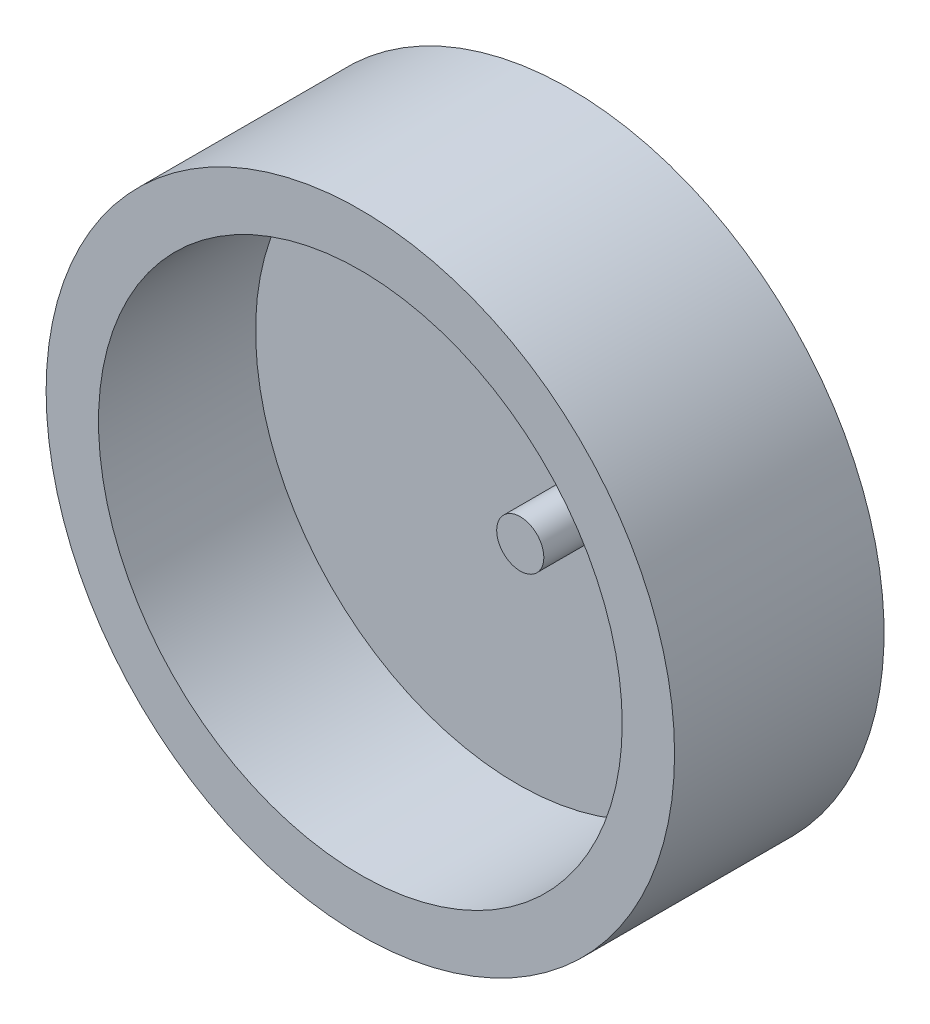
ISO-10303-21;
HEADER;
FILE_DESCRIPTION(('STEP AP214'),'2;1');
FILE_NAME('part.step','',(''),(''),'','','');
FILE_SCHEMA(('AUTOMOTIVE_DESIGN { 1 0 10303 214 1 1 1 1 }'));
ENDSEC;
DATA;
#1=APPLICATION_CONTEXT('core data for automotive mechanical design processes');
#2=APPLICATION_PROTOCOL_DEFINITION('international standard','automotive_design',2000,#1);
#3=PRODUCT_CONTEXT('',#1,'mechanical');
#4=PRODUCT('Part','Part','',(#3));
#5=PRODUCT_RELATED_PRODUCT_CATEGORY('part','',(#4));
#6=PRODUCT_DEFINITION_FORMATION('','',#4);
#7=PRODUCT_DEFINITION_CONTEXT('part definition',#1,'design');
#8=PRODUCT_DEFINITION('design','',#6,#7);
#9=PRODUCT_DEFINITION_SHAPE('','',#8);
#10=(LENGTH_UNIT() NAMED_UNIT(*) SI_UNIT(.MILLI.,.METRE.));
#11=(NAMED_UNIT(*) PLANE_ANGLE_UNIT() SI_UNIT($,.RADIAN.));
#12=(NAMED_UNIT(*) SI_UNIT($,.STERADIAN.) SOLID_ANGLE_UNIT());
#13=UNCERTAINTY_MEASURE_WITH_UNIT(LENGTH_MEASURE(1.E-05),#10,'distance_accuracy_value','');
#14=(GEOMETRIC_REPRESENTATION_CONTEXT(3) GLOBAL_UNCERTAINTY_ASSIGNED_CONTEXT((#13)) GLOBAL_UNIT_ASSIGNED_CONTEXT((#10,
#11,#12)) REPRESENTATION_CONTEXT('',''));
#15=CARTESIAN_POINT('',(0.,0.,0.));
#16=DIRECTION('',(0.,0.,1.));
#17=DIRECTION('',(1.,0.,0.));
#18=AXIS2_PLACEMENT_3D('',#15,#16,#17);
#19=CARTESIAN_POINT('',(0.,0.,30.));
#20=DIRECTION('',(0.,0.,1.));
#21=DIRECTION('',(1.,0.,0.));
#22=AXIS2_PLACEMENT_3D('',#19,#20,#21);
#23=PLANE('',#22);
#24=CARTESIAN_POINT('',(0.,0.,30.));
#25=DIRECTION('',(0.,0.,1.));
#26=DIRECTION('',(1.,0.,0.));
#27=AXIS2_PLACEMENT_3D('',#24,#25,#26);
#28=CIRCLE('',#27,60.);
#29=CARTESIAN_POINT('',(60.,0.,30.));
#30=VERTEX_POINT('',#29);
#31=EDGE_CURVE('E45',#30,#30,#28,.T.);
#32=ORIENTED_EDGE('',*,*,#31,.T.);
#33=EDGE_LOOP('',(#32));
#34=FACE_BOUND('',#33,.T.);
#35=CARTESIAN_POINT('',(0.,0.,30.));
#36=DIRECTION('',(0.,0.,1.));
#37=DIRECTION('',(1.,0.,0.));
#38=AXIS2_PLACEMENT_3D('',#35,#36,#37);
#39=CIRCLE('',#38,50.);
#40=CARTESIAN_POINT('',(50.,0.,30.));
#41=VERTEX_POINT('',#40);
#42=EDGE_CURVE('E50',#41,#41,#39,.T.);
#43=ORIENTED_EDGE('',*,*,#42,.F.);
#44=EDGE_LOOP('',(#43));
#45=FACE_BOUND('',#44,.T.);
#46=ADVANCED_FACE('F37',(#34,#45),#23,.T.);
#47=CARTESIAN_POINT('',(0.,0.,30.));
#48=DIRECTION('',(0.,0.,-1.));
#49=DIRECTION('',(-1.,0.,0.));
#50=AXIS2_PLACEMENT_3D('',#47,#48,#49);
#51=CYLINDRICAL_SURFACE('',#50,60.);
#52=ORIENTED_EDGE('',*,*,#31,.F.);
#53=EDGE_LOOP('',(#52));
#54=FACE_BOUND('',#53,.T.);
#55=CARTESIAN_POINT('',(0.,0.,-10.));
#56=DIRECTION('',(0.,0.,-1.));
#57=DIRECTION('',(-1.,0.,0.));
#58=AXIS2_PLACEMENT_3D('',#55,#56,#57);
#59=CIRCLE('',#58,60.);
#60=CARTESIAN_POINT('',(-60.,0.,-10.));
#61=VERTEX_POINT('',#60);
#62=EDGE_CURVE('E60',#61,#61,#59,.T.);
#63=ORIENTED_EDGE('',*,*,#62,.F.);
#64=EDGE_LOOP('',(#63));
#65=FACE_BOUND('',#64,.T.);
#66=ADVANCED_FACE('F39',(#54,#65),#51,.T.);
#67=CARTESIAN_POINT('',(0.,0.,30.));
#68=DIRECTION('',(0.,0.,-1.));
#69=DIRECTION('',(-1.,0.,0.));
#70=AXIS2_PLACEMENT_3D('',#67,#68,#69);
#71=CYLINDRICAL_SURFACE('',#70,50.);
#72=ORIENTED_EDGE('',*,*,#42,.T.);
#73=EDGE_LOOP('',(#72));
#74=FACE_BOUND('',#73,.T.);
#75=CARTESIAN_POINT('',(0.,0.,0.));
#76=DIRECTION('',(0.,0.,1.));
#77=DIRECTION('',(1.,0.,0.));
#78=AXIS2_PLACEMENT_3D('',#75,#76,#77);
#79=CIRCLE('',#78,50.);
#80=CARTESIAN_POINT('',(50.,0.,0.));
#81=VERTEX_POINT('',#80);
#82=EDGE_CURVE('E55',#81,#81,#79,.T.);
#83=ORIENTED_EDGE('',*,*,#82,.F.);
#84=EDGE_LOOP('',(#83));
#85=FACE_BOUND('',#84,.T.);
#86=ADVANCED_FACE('F88',(#74,#85),#71,.F.);
#87=CARTESIAN_POINT('',(0.,0.,0.));
#88=DIRECTION('',(0.,0.,-1.));
#89=DIRECTION('',(-1.,0.,0.));
#90=AXIS2_PLACEMENT_3D('',#87,#88,#89);
#91=PLANE('',#90);
#92=CARTESIAN_POINT('',(10.5345039355532,0.,0.));
#93=DIRECTION('',(0.,0.,-1.));
#94=DIRECTION('',(-1.,0.,0.));
#95=AXIS2_PLACEMENT_3D('',#92,#93,#94);
#96=CIRCLE('',#95,4.5);
#97=CARTESIAN_POINT('',(6.03450393555324,0.,0.));
#98=VERTEX_POINT('',#97);
#99=EDGE_CURVE('E10',#98,#98,#96,.F.);
#100=ORIENTED_EDGE('',*,*,#99,.F.);
#101=EDGE_LOOP('',(#100));
#102=FACE_BOUND('',#101,.T.);
#103=ORIENTED_EDGE('',*,*,#82,.T.);
#104=EDGE_LOOP('',(#103));
#105=FACE_BOUND('',#104,.T.);
#106=ADVANCED_FACE('F81',(#102,#105),#91,.F.);
#107=CARTESIAN_POINT('',(0.,0.,-10.));
#108=DIRECTION('',(0.,0.,-1.));
#109=DIRECTION('',(-1.,0.,0.));
#110=AXIS2_PLACEMENT_3D('',#107,#108,#109);
#111=PLANE('',#110);
#112=ORIENTED_EDGE('',*,*,#62,.T.);
#113=EDGE_LOOP('',(#112));
#114=FACE_BOUND('',#113,.T.);
#115=ADVANCED_FACE('F74',(#114),#111,.T.);
#116=CARTESIAN_POINT('',(10.5345039355532,0.,10.));
#117=DIRECTION('',(0.,0.,-1.));
#118=DIRECTION('',(-1.,0.,0.));
#119=AXIS2_PLACEMENT_3D('',#116,#117,#118);
#120=CYLINDRICAL_SURFACE('',#119,4.5);
#121=CARTESIAN_POINT('',(10.5345039355532,0.,10.));
#122=DIRECTION('',(0.,0.,1.));
#123=DIRECTION('',(1.,0.,0.));
#124=AXIS2_PLACEMENT_3D('',#121,#122,#123);
#125=CIRCLE('',#124,4.5);
#126=CARTESIAN_POINT('',(15.0345039355532,0.,10.));
#127=VERTEX_POINT('',#126);
#128=EDGE_CURVE('E65',#127,#127,#125,.T.);
#129=ORIENTED_EDGE('',*,*,#128,.F.);
#130=EDGE_LOOP('',(#129));
#131=FACE_BOUND('',#130,.T.);
#132=ORIENTED_EDGE('',*,*,#99,.T.);
#133=EDGE_LOOP('',(#132));
#134=FACE_BOUND('',#133,.T.);
#135=ADVANCED_FACE('F72',(#131,#134),#120,.T.);
#136=CARTESIAN_POINT('',(10.5345039355532,0.,10.));
#137=DIRECTION('',(0.,0.,1.));
#138=DIRECTION('',(1.,0.,0.));
#139=AXIS2_PLACEMENT_3D('',#136,#137,#138);
#140=PLANE('',#139);
#141=ORIENTED_EDGE('',*,*,#128,.T.);
#142=EDGE_LOOP('',(#141));
#143=FACE_BOUND('',#142,.T.);
#144=ADVANCED_FACE('F70',(#143),#140,.T.);
#145=CLOSED_SHELL('',(#46,#66,#86,#106,#115,#135,#144));
#146=MANIFOLD_SOLID_BREP('B2',#145);
#147=ADVANCED_BREP_SHAPE_REPRESENTATION('',(#18,#146),#14);
#148=SHAPE_DEFINITION_REPRESENTATION(#9,#147);
ENDSEC;
END-ISO-10303-21;
